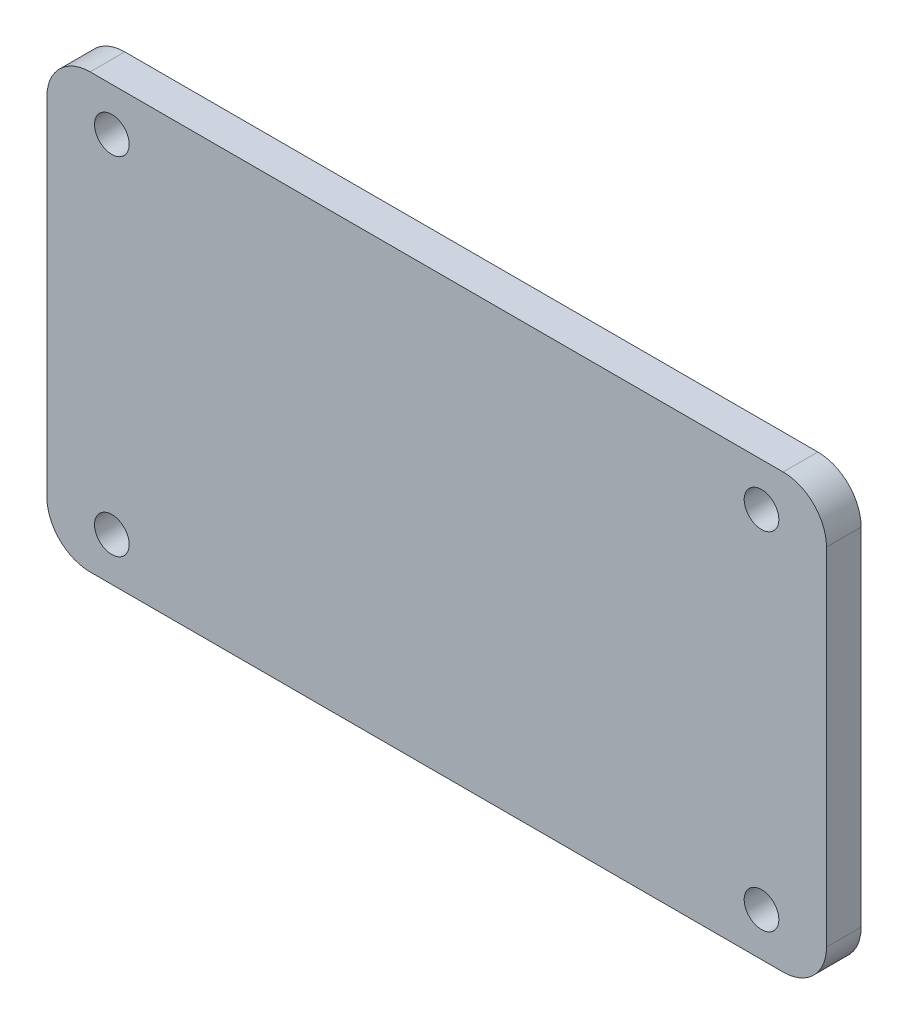
ISO-10303-21;
HEADER;
FILE_DESCRIPTION(('STEP AP214'),'2;1');
FILE_NAME('part.step','',(''),(''),'','','');
FILE_SCHEMA(('AUTOMOTIVE_DESIGN { 1 0 10303 214 1 1 1 1 }'));
ENDSEC;
DATA;
#1=APPLICATION_CONTEXT('core data for automotive mechanical design processes');
#2=APPLICATION_PROTOCOL_DEFINITION('international standard','automotive_design',2000,#1);
#3=PRODUCT_CONTEXT('',#1,'mechanical');
#4=PRODUCT('Part','Part','',(#3));
#5=PRODUCT_RELATED_PRODUCT_CATEGORY('part','',(#4));
#6=PRODUCT_DEFINITION_FORMATION('','',#4);
#7=PRODUCT_DEFINITION_CONTEXT('part definition',#1,'design');
#8=PRODUCT_DEFINITION('design','',#6,#7);
#9=PRODUCT_DEFINITION_SHAPE('','',#8);
#10=(LENGTH_UNIT() NAMED_UNIT(*) SI_UNIT(.MILLI.,.METRE.));
#11=(NAMED_UNIT(*) PLANE_ANGLE_UNIT() SI_UNIT($,.RADIAN.));
#12=(NAMED_UNIT(*) SI_UNIT($,.STERADIAN.) SOLID_ANGLE_UNIT());
#13=UNCERTAINTY_MEASURE_WITH_UNIT(LENGTH_MEASURE(1.E-05),#10,'distance_accuracy_value','');
#14=(GEOMETRIC_REPRESENTATION_CONTEXT(3) GLOBAL_UNCERTAINTY_ASSIGNED_CONTEXT((#13)) GLOBAL_UNIT_ASSIGNED_CONTEXT((#10,
#11,#12)) REPRESENTATION_CONTEXT('',''));
#15=CARTESIAN_POINT('',(0.,0.,0.));
#16=DIRECTION('',(0.,0.,1.));
#17=DIRECTION('',(1.,0.,0.));
#18=AXIS2_PLACEMENT_3D('',#15,#16,#17);
#19=CARTESIAN_POINT('',(0.,0.,4.));
#20=DIRECTION('',(0.,0.,-1.));
#21=DIRECTION('',(-1.,0.,0.));
#22=AXIS2_PLACEMENT_3D('',#19,#20,#21);
#23=PLANE('',#22);
#24=DIRECTION('',(0.,-1.,0.));
#25=VECTOR('',#24,1.);
#26=CARTESIAN_POINT('',(-45.,-25.,4.));
#27=LINE('',#26,#25);
#28=CARTESIAN_POINT('',(-45.,20.,4.));
#29=VERTEX_POINT('',#28);
#30=CARTESIAN_POINT('',(-45.,-20.,4.));
#31=VERTEX_POINT('',#30);
#32=EDGE_CURVE('E179',#29,#31,#27,.T.);
#33=ORIENTED_EDGE('',*,*,#32,.T.);
#34=CARTESIAN_POINT('',(-40.,-20.,4.));
#35=DIRECTION('',(0.,0.,-1.));
#36=DIRECTION('',(-1.,0.,0.));
#37=AXIS2_PLACEMENT_3D('',#34,#35,#36);
#38=CIRCLE('',#37,5.);
#39=CARTESIAN_POINT('',(-40.,-25.,4.));
#40=VERTEX_POINT('',#39);
#41=EDGE_CURVE('E156',#31,#40,#38,.F.);
#42=ORIENTED_EDGE('',*,*,#41,.T.);
#43=DIRECTION('',(1.,0.,0.));
#44=VECTOR('',#43,1.);
#45=CARTESIAN_POINT('',(-45.,-25.,4.));
#46=LINE('',#45,#44);
#47=CARTESIAN_POINT('',(40.,-25.,4.));
#48=VERTEX_POINT('',#47);
#49=EDGE_CURVE('E127',#40,#48,#46,.T.);
#50=ORIENTED_EDGE('',*,*,#49,.T.);
#51=CARTESIAN_POINT('',(40.,-20.,4.));
#52=DIRECTION('',(0.,0.,-1.));
#53=DIRECTION('',(-1.,0.,0.));
#54=AXIS2_PLACEMENT_3D('',#51,#52,#53);
#55=CIRCLE('',#54,5.);
#56=CARTESIAN_POINT('',(45.,-20.,4.));
#57=VERTEX_POINT('',#56);
#58=EDGE_CURVE('E154',#48,#57,#55,.F.);
#59=ORIENTED_EDGE('',*,*,#58,.T.);
#60=DIRECTION('',(0.,1.,0.));
#61=VECTOR('',#60,1.);
#62=CARTESIAN_POINT('',(45.,-25.,4.));
#63=LINE('',#62,#61);
#64=CARTESIAN_POINT('',(45.,20.,4.));
#65=VERTEX_POINT('',#64);
#66=EDGE_CURVE('E134',#57,#65,#63,.T.);
#67=ORIENTED_EDGE('',*,*,#66,.T.);
#68=CARTESIAN_POINT('',(40.,20.,4.));
#69=DIRECTION('',(0.,0.,-1.));
#70=DIRECTION('',(-1.,0.,0.));
#71=AXIS2_PLACEMENT_3D('',#68,#69,#70);
#72=CIRCLE('',#71,5.);
#73=CARTESIAN_POINT('',(40.,25.,4.));
#74=VERTEX_POINT('',#73);
#75=EDGE_CURVE('E62',#65,#74,#72,.F.);
#76=ORIENTED_EDGE('',*,*,#75,.T.);
#77=DIRECTION('',(-1.,0.,0.));
#78=VECTOR('',#77,1.);
#79=CARTESIAN_POINT('',(-45.,25.,4.));
#80=LINE('',#79,#78);
#81=CARTESIAN_POINT('',(-40.,25.,4.));
#82=VERTEX_POINT('',#81);
#83=EDGE_CURVE('E137',#74,#82,#80,.T.);
#84=ORIENTED_EDGE('',*,*,#83,.T.);
#85=CARTESIAN_POINT('',(-40.,20.,4.));
#86=DIRECTION('',(0.,0.,-1.));
#87=DIRECTION('',(-1.,0.,0.));
#88=AXIS2_PLACEMENT_3D('',#85,#86,#87);
#89=CIRCLE('',#88,5.);
#90=EDGE_CURVE('E151',#82,#29,#89,.F.);
#91=ORIENTED_EDGE('',*,*,#90,.T.);
#92=EDGE_LOOP('',(#33,#42,#50,#59,#67,#76,#84,#91));
#93=FACE_BOUND('',#92,.T.);
#94=CARTESIAN_POINT('',(-37.5,20.,4.));
#95=DIRECTION('',(0.,0.,1.));
#96=DIRECTION('',(1.,0.,0.));
#97=AXIS2_PLACEMENT_3D('',#94,#95,#96);
#98=CIRCLE('',#97,2.);
#99=CARTESIAN_POINT('',(-35.5,20.,4.));
#100=VERTEX_POINT('',#99);
#101=EDGE_CURVE('E172',#100,#100,#98,.T.);
#102=ORIENTED_EDGE('',*,*,#101,.F.);
#103=EDGE_LOOP('',(#102));
#104=FACE_BOUND('',#103,.T.);
#105=CARTESIAN_POINT('',(-37.5,-20.,4.));
#106=DIRECTION('',(0.,0.,1.));
#107=DIRECTION('',(1.,0.,0.));
#108=AXIS2_PLACEMENT_3D('',#105,#106,#107);
#109=CIRCLE('',#108,2.);
#110=CARTESIAN_POINT('',(-35.5,-20.,4.));
#111=VERTEX_POINT('',#110);
#112=EDGE_CURVE('E184',#111,#111,#109,.T.);
#113=ORIENTED_EDGE('',*,*,#112,.F.);
#114=EDGE_LOOP('',(#113));
#115=FACE_BOUND('',#114,.T.);
#116=CARTESIAN_POINT('',(37.5,-20.,4.));
#117=DIRECTION('',(0.,0.,1.));
#118=DIRECTION('',(1.,0.,0.));
#119=AXIS2_PLACEMENT_3D('',#116,#117,#118);
#120=CIRCLE('',#119,2.);
#121=CARTESIAN_POINT('',(39.5,-20.,4.));
#122=VERTEX_POINT('',#121);
#123=EDGE_CURVE('E189',#122,#122,#120,.T.);
#124=ORIENTED_EDGE('',*,*,#123,.F.);
#125=EDGE_LOOP('',(#124));
#126=FACE_BOUND('',#125,.T.);
#127=CARTESIAN_POINT('',(37.5,20.,4.));
#128=DIRECTION('',(0.,0.,1.));
#129=DIRECTION('',(1.,0.,0.));
#130=AXIS2_PLACEMENT_3D('',#127,#128,#129);
#131=CIRCLE('',#130,2.);
#132=CARTESIAN_POINT('',(39.5,20.,4.));
#133=VERTEX_POINT('',#132);
#134=EDGE_CURVE('E195',#133,#133,#131,.T.);
#135=ORIENTED_EDGE('',*,*,#134,.F.);
#136=EDGE_LOOP('',(#135));
#137=FACE_BOUND('',#136,.T.);
#138=ADVANCED_FACE('F41',(#93,#104,#115,#126,#137),#23,.F.);
#139=CARTESIAN_POINT('',(0.,0.,0.));
#140=DIRECTION('',(0.,0.,-1.));
#141=DIRECTION('',(-1.,0.,0.));
#142=AXIS2_PLACEMENT_3D('',#139,#140,#141);
#143=PLANE('',#142);
#144=CARTESIAN_POINT('',(37.5,-20.,0.));
#145=DIRECTION('',(0.,0.,1.));
#146=DIRECTION('',(1.,0.,0.));
#147=AXIS2_PLACEMENT_3D('',#144,#145,#146);
#148=CIRCLE('',#147,2.);
#149=CARTESIAN_POINT('',(39.5,-20.,0.));
#150=VERTEX_POINT('',#149);
#151=EDGE_CURVE('E192',#150,#150,#148,.T.);
#152=ORIENTED_EDGE('',*,*,#151,.T.);
#153=EDGE_LOOP('',(#152));
#154=FACE_BOUND('',#153,.T.);
#155=CARTESIAN_POINT('',(-37.5,20.,0.));
#156=DIRECTION('',(0.,0.,1.));
#157=DIRECTION('',(1.,0.,0.));
#158=AXIS2_PLACEMENT_3D('',#155,#156,#157);
#159=CIRCLE('',#158,2.);
#160=CARTESIAN_POINT('',(-35.5,20.,0.));
#161=VERTEX_POINT('',#160);
#162=EDGE_CURVE('E175',#161,#161,#159,.T.);
#163=ORIENTED_EDGE('',*,*,#162,.T.);
#164=EDGE_LOOP('',(#163));
#165=FACE_BOUND('',#164,.T.);
#166=DIRECTION('',(1.,0.,0.));
#167=VECTOR('',#166,1.);
#168=CARTESIAN_POINT('',(-45.,-25.,0.));
#169=LINE('',#168,#167);
#170=CARTESIAN_POINT('',(-40.,-25.,0.));
#171=VERTEX_POINT('',#170);
#172=CARTESIAN_POINT('',(40.,-25.,0.));
#173=VERTEX_POINT('',#172);
#174=EDGE_CURVE('E124',#171,#173,#169,.T.);
#175=ORIENTED_EDGE('',*,*,#174,.F.);
#176=CARTESIAN_POINT('',(-40.,-20.,0.));
#177=DIRECTION('',(0.,0.,-1.));
#178=DIRECTION('',(-1.,0.,0.));
#179=AXIS2_PLACEMENT_3D('',#176,#177,#178);
#180=CIRCLE('',#179,5.);
#181=CARTESIAN_POINT('',(-45.,-20.,0.));
#182=VERTEX_POINT('',#181);
#183=EDGE_CURVE('E107',#171,#182,#180,.T.);
#184=ORIENTED_EDGE('',*,*,#183,.T.);
#185=DIRECTION('',(0.,-1.,0.));
#186=VECTOR('',#185,1.);
#187=CARTESIAN_POINT('',(-45.,-25.,0.));
#188=LINE('',#187,#186);
#189=CARTESIAN_POINT('',(-45.,20.,0.));
#190=VERTEX_POINT('',#189);
#191=EDGE_CURVE('E135',#190,#182,#188,.T.);
#192=ORIENTED_EDGE('',*,*,#191,.F.);
#193=CARTESIAN_POINT('',(-40.,20.,0.));
#194=DIRECTION('',(0.,0.,-1.));
#195=DIRECTION('',(-1.,0.,0.));
#196=AXIS2_PLACEMENT_3D('',#193,#194,#195);
#197=CIRCLE('',#196,5.);
#198=CARTESIAN_POINT('',(-40.,25.,0.));
#199=VERTEX_POINT('',#198);
#200=EDGE_CURVE('E128',#190,#199,#197,.T.);
#201=ORIENTED_EDGE('',*,*,#200,.T.);
#202=DIRECTION('',(-1.,0.,0.));
#203=VECTOR('',#202,1.);
#204=CARTESIAN_POINT('',(-45.,25.,0.));
#205=LINE('',#204,#203);
#206=CARTESIAN_POINT('',(40.,25.,0.));
#207=VERTEX_POINT('',#206);
#208=EDGE_CURVE('E139',#207,#199,#205,.T.);
#209=ORIENTED_EDGE('',*,*,#208,.F.);
#210=CARTESIAN_POINT('',(40.,20.,0.));
#211=DIRECTION('',(0.,0.,-1.));
#212=DIRECTION('',(-1.,0.,0.));
#213=AXIS2_PLACEMENT_3D('',#210,#211,#212);
#214=CIRCLE('',#213,5.);
#215=CARTESIAN_POINT('',(45.,20.,0.));
#216=VERTEX_POINT('',#215);
#217=EDGE_CURVE('E145',#207,#216,#214,.T.);
#218=ORIENTED_EDGE('',*,*,#217,.T.);
#219=DIRECTION('',(0.,1.,0.));
#220=VECTOR('',#219,1.);
#221=CARTESIAN_POINT('',(45.,-25.,0.));
#222=LINE('',#221,#220);
#223=CARTESIAN_POINT('',(45.,-20.,0.));
#224=VERTEX_POINT('',#223);
#225=EDGE_CURVE('E167',#224,#216,#222,.T.);
#226=ORIENTED_EDGE('',*,*,#225,.F.);
#227=CARTESIAN_POINT('',(40.,-20.,0.));
#228=DIRECTION('',(0.,0.,-1.));
#229=DIRECTION('',(-1.,0.,0.));
#230=AXIS2_PLACEMENT_3D('',#227,#228,#229);
#231=CIRCLE('',#230,5.);
#232=EDGE_CURVE('E118',#224,#173,#231,.T.);
#233=ORIENTED_EDGE('',*,*,#232,.T.);
#234=EDGE_LOOP('',(#175,#184,#192,#201,#209,#218,#226,#233));
#235=FACE_BOUND('',#234,.T.);
#236=CARTESIAN_POINT('',(-37.5,-20.,0.));
#237=DIRECTION('',(0.,0.,1.));
#238=DIRECTION('',(1.,0.,0.));
#239=AXIS2_PLACEMENT_3D('',#236,#237,#238);
#240=CIRCLE('',#239,2.);
#241=CARTESIAN_POINT('',(-35.5,-20.,0.));
#242=VERTEX_POINT('',#241);
#243=EDGE_CURVE('E186',#242,#242,#240,.T.);
#244=ORIENTED_EDGE('',*,*,#243,.T.);
#245=EDGE_LOOP('',(#244));
#246=FACE_BOUND('',#245,.T.);
#247=CARTESIAN_POINT('',(37.5,20.,0.));
#248=DIRECTION('',(0.,0.,1.));
#249=DIRECTION('',(1.,0.,0.));
#250=AXIS2_PLACEMENT_3D('',#247,#248,#249);
#251=CIRCLE('',#250,2.);
#252=CARTESIAN_POINT('',(39.5,20.,0.));
#253=VERTEX_POINT('',#252);
#254=EDGE_CURVE('E198',#253,#253,#251,.T.);
#255=ORIENTED_EDGE('',*,*,#254,.T.);
#256=EDGE_LOOP('',(#255));
#257=FACE_BOUND('',#256,.T.);
#258=ADVANCED_FACE('F131',(#154,#165,#235,#246,#257),#143,.T.);
#259=CARTESIAN_POINT('',(45.,-25.,4.));
#260=DIRECTION('',(-1.,0.,0.));
#261=DIRECTION('',(0.,0.,1.));
#262=AXIS2_PLACEMENT_3D('',#259,#260,#261);
#263=PLANE('',#262);
#264=ORIENTED_EDGE('',*,*,#66,.F.);
#265=DIRECTION('',(0.,0.,-1.));
#266=VECTOR('',#265,1.);
#267=CARTESIAN_POINT('',(45.,-20.,4.));
#268=LINE('',#267,#266);
#269=EDGE_CURVE('E160',#57,#224,#268,.T.);
#270=ORIENTED_EDGE('',*,*,#269,.T.);
#271=ORIENTED_EDGE('',*,*,#225,.T.);
#272=DIRECTION('',(0.,0.,-1.));
#273=VECTOR('',#272,1.);
#274=CARTESIAN_POINT('',(45.,20.,4.));
#275=LINE('',#274,#273);
#276=EDGE_CURVE('E158',#216,#65,#275,.F.);
#277=ORIENTED_EDGE('',*,*,#276,.T.);
#278=EDGE_LOOP('',(#264,#270,#271,#277));
#279=FACE_BOUND('',#278,.T.);
#280=ADVANCED_FACE('F166',(#279),#263,.F.);
#281=CARTESIAN_POINT('',(-45.,25.,4.));
#282=DIRECTION('',(0.,-1.,0.));
#283=DIRECTION('',(0.,0.,-1.));
#284=AXIS2_PLACEMENT_3D('',#281,#282,#283);
#285=PLANE('',#284);
#286=ORIENTED_EDGE('',*,*,#83,.F.);
#287=DIRECTION('',(0.,0.,-1.));
#288=VECTOR('',#287,1.);
#289=CARTESIAN_POINT('',(40.,25.,4.));
#290=LINE('',#289,#288);
#291=EDGE_CURVE('E11',#74,#207,#290,.T.);
#292=ORIENTED_EDGE('',*,*,#291,.T.);
#293=ORIENTED_EDGE('',*,*,#208,.T.);
#294=DIRECTION('',(0.,0.,-1.));
#295=VECTOR('',#294,1.);
#296=CARTESIAN_POINT('',(-40.,25.,4.));
#297=LINE('',#296,#295);
#298=EDGE_CURVE('E49',#199,#82,#297,.F.);
#299=ORIENTED_EDGE('',*,*,#298,.T.);
#300=EDGE_LOOP('',(#286,#292,#293,#299));
#301=FACE_BOUND('',#300,.T.);
#302=ADVANCED_FACE('F225',(#301),#285,.F.);
#303=CARTESIAN_POINT('',(-45.,-25.,4.));
#304=DIRECTION('',(1.,0.,0.));
#305=DIRECTION('',(0.,0.,-1.));
#306=AXIS2_PLACEMENT_3D('',#303,#304,#305);
#307=PLANE('',#306);
#308=ORIENTED_EDGE('',*,*,#191,.T.);
#309=DIRECTION('',(0.,0.,-1.));
#310=VECTOR('',#309,1.);
#311=CARTESIAN_POINT('',(-45.,-20.,4.));
#312=LINE('',#311,#310);
#313=EDGE_CURVE('E112',#182,#31,#312,.F.);
#314=ORIENTED_EDGE('',*,*,#313,.T.);
#315=ORIENTED_EDGE('',*,*,#32,.F.);
#316=DIRECTION('',(0.,0.,-1.));
#317=VECTOR('',#316,1.);
#318=CARTESIAN_POINT('',(-45.,20.,4.));
#319=LINE('',#318,#317);
#320=EDGE_CURVE('E117',#29,#190,#319,.T.);
#321=ORIENTED_EDGE('',*,*,#320,.T.);
#322=EDGE_LOOP('',(#308,#314,#315,#321));
#323=FACE_BOUND('',#322,.T.);
#324=ADVANCED_FACE('F222',(#323),#307,.F.);
#325=CARTESIAN_POINT('',(-45.,-25.,4.));
#326=DIRECTION('',(0.,1.,0.));
#327=DIRECTION('',(0.,0.,1.));
#328=AXIS2_PLACEMENT_3D('',#325,#326,#327);
#329=PLANE('',#328);
#330=ORIENTED_EDGE('',*,*,#49,.F.);
#331=DIRECTION('',(0.,0.,-1.));
#332=VECTOR('',#331,1.);
#333=CARTESIAN_POINT('',(-40.,-25.,4.));
#334=LINE('',#333,#332);
#335=EDGE_CURVE('E111',#40,#171,#334,.T.);
#336=ORIENTED_EDGE('',*,*,#335,.T.);
#337=ORIENTED_EDGE('',*,*,#174,.T.);
#338=DIRECTION('',(0.,0.,-1.));
#339=VECTOR('',#338,1.);
#340=CARTESIAN_POINT('',(40.,-25.,4.));
#341=LINE('',#340,#339);
#342=EDGE_CURVE('E129',#173,#48,#341,.F.);
#343=ORIENTED_EDGE('',*,*,#342,.T.);
#344=EDGE_LOOP('',(#330,#336,#337,#343));
#345=FACE_BOUND('',#344,.T.);
#346=ADVANCED_FACE('F123',(#345),#329,.F.);
#347=CARTESIAN_POINT('',(-37.5,20.,4.));
#348=DIRECTION('',(0.,0.,-1.));
#349=DIRECTION('',(-1.,0.,0.));
#350=AXIS2_PLACEMENT_3D('',#347,#348,#349);
#351=CYLINDRICAL_SURFACE('',#350,2.);
#352=ORIENTED_EDGE('',*,*,#101,.T.);
#353=EDGE_LOOP('',(#352));
#354=FACE_BOUND('',#353,.T.);
#355=ORIENTED_EDGE('',*,*,#162,.F.);
#356=EDGE_LOOP('',(#355));
#357=FACE_BOUND('',#356,.T.);
#358=ADVANCED_FACE('F217',(#354,#357),#351,.F.);
#359=CARTESIAN_POINT('',(-37.5,-20.,4.));
#360=DIRECTION('',(0.,0.,-1.));
#361=DIRECTION('',(-1.,0.,0.));
#362=AXIS2_PLACEMENT_3D('',#359,#360,#361);
#363=CYLINDRICAL_SURFACE('',#362,2.);
#364=ORIENTED_EDGE('',*,*,#112,.T.);
#365=EDGE_LOOP('',(#364));
#366=FACE_BOUND('',#365,.T.);
#367=ORIENTED_EDGE('',*,*,#243,.F.);
#368=EDGE_LOOP('',(#367));
#369=FACE_BOUND('',#368,.T.);
#370=ADVANCED_FACE('F282',(#366,#369),#363,.F.);
#371=CARTESIAN_POINT('',(37.5,-20.,4.));
#372=DIRECTION('',(0.,0.,-1.));
#373=DIRECTION('',(-1.,0.,0.));
#374=AXIS2_PLACEMENT_3D('',#371,#372,#373);
#375=CYLINDRICAL_SURFACE('',#374,2.);
#376=ORIENTED_EDGE('',*,*,#123,.T.);
#377=EDGE_LOOP('',(#376));
#378=FACE_BOUND('',#377,.T.);
#379=ORIENTED_EDGE('',*,*,#151,.F.);
#380=EDGE_LOOP('',(#379));
#381=FACE_BOUND('',#380,.T.);
#382=ADVANCED_FACE('F273',(#378,#381),#375,.F.);
#383=CARTESIAN_POINT('',(37.5,20.,4.));
#384=DIRECTION('',(0.,0.,-1.));
#385=DIRECTION('',(-1.,0.,0.));
#386=AXIS2_PLACEMENT_3D('',#383,#384,#385);
#387=CYLINDRICAL_SURFACE('',#386,2.);
#388=ORIENTED_EDGE('',*,*,#134,.T.);
#389=EDGE_LOOP('',(#388));
#390=FACE_BOUND('',#389,.T.);
#391=ORIENTED_EDGE('',*,*,#254,.F.);
#392=EDGE_LOOP('',(#391));
#393=FACE_BOUND('',#392,.T.);
#394=ADVANCED_FACE('F204',(#390,#393),#387,.F.);
#395=CARTESIAN_POINT('',(-40.,-20.,4.));
#396=DIRECTION('',(0.,0.,-1.));
#397=DIRECTION('',(-1.,0.,0.));
#398=AXIS2_PLACEMENT_3D('',#395,#396,#397);
#399=CYLINDRICAL_SURFACE('',#398,5.);
#400=ORIENTED_EDGE('',*,*,#41,.F.);
#401=ORIENTED_EDGE('',*,*,#313,.F.);
#402=ORIENTED_EDGE('',*,*,#183,.F.);
#403=ORIENTED_EDGE('',*,*,#335,.F.);
#404=EDGE_LOOP('',(#400,#401,#402,#403));
#405=FACE_BOUND('',#404,.T.);
#406=ADVANCED_FACE('F110',(#405),#399,.T.);
#407=CARTESIAN_POINT('',(40.,-20.,4.));
#408=DIRECTION('',(0.,0.,-1.));
#409=DIRECTION('',(-1.,0.,0.));
#410=AXIS2_PLACEMENT_3D('',#407,#408,#409);
#411=CYLINDRICAL_SURFACE('',#410,5.);
#412=ORIENTED_EDGE('',*,*,#58,.F.);
#413=ORIENTED_EDGE('',*,*,#342,.F.);
#414=ORIENTED_EDGE('',*,*,#232,.F.);
#415=ORIENTED_EDGE('',*,*,#269,.F.);
#416=EDGE_LOOP('',(#412,#413,#414,#415));
#417=FACE_BOUND('',#416,.T.);
#418=ADVANCED_FACE('F233',(#417),#411,.T.);
#419=CARTESIAN_POINT('',(40.,20.,4.));
#420=DIRECTION('',(0.,0.,-1.));
#421=DIRECTION('',(-1.,0.,0.));
#422=AXIS2_PLACEMENT_3D('',#419,#420,#421);
#423=CYLINDRICAL_SURFACE('',#422,5.);
#424=ORIENTED_EDGE('',*,*,#75,.F.);
#425=ORIENTED_EDGE('',*,*,#276,.F.);
#426=ORIENTED_EDGE('',*,*,#217,.F.);
#427=ORIENTED_EDGE('',*,*,#291,.F.);
#428=EDGE_LOOP('',(#424,#425,#426,#427));
#429=FACE_BOUND('',#428,.T.);
#430=ADVANCED_FACE('F235',(#429),#423,.T.);
#431=CARTESIAN_POINT('',(-40.,20.,4.));
#432=DIRECTION('',(0.,0.,-1.));
#433=DIRECTION('',(-1.,0.,0.));
#434=AXIS2_PLACEMENT_3D('',#431,#432,#433);
#435=CYLINDRICAL_SURFACE('',#434,5.);
#436=ORIENTED_EDGE('',*,*,#90,.F.);
#437=ORIENTED_EDGE('',*,*,#298,.F.);
#438=ORIENTED_EDGE('',*,*,#200,.F.);
#439=ORIENTED_EDGE('',*,*,#320,.F.);
#440=EDGE_LOOP('',(#436,#437,#438,#439));
#441=FACE_BOUND('',#440,.T.);
#442=ADVANCED_FACE('F43',(#441),#435,.T.);
#443=CLOSED_SHELL('',(#138,#258,#280,#302,#324,#346,#358,#370,#382,#394,#406,#418,#430,#442));
#444=MANIFOLD_SOLID_BREP('B2',#443);
#445=ADVANCED_BREP_SHAPE_REPRESENTATION('',(#18,#444),#14);
#446=SHAPE_DEFINITION_REPRESENTATION(#9,#445);
ENDSEC;
END-ISO-10303-21;
